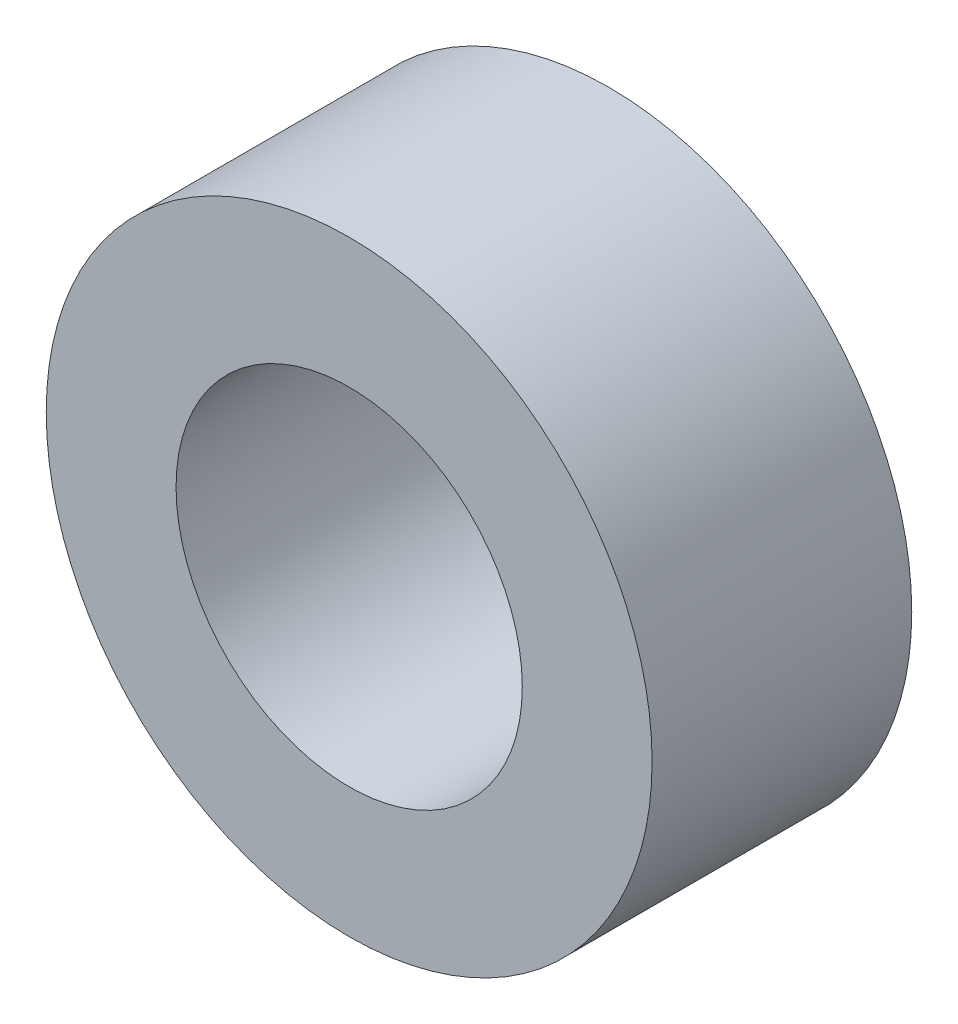
ISO-10303-21;
HEADER;
FILE_DESCRIPTION(('STEP AP214'),'2;1');
FILE_NAME('part.step','',(''),(''),'','','');
FILE_SCHEMA(('AUTOMOTIVE_DESIGN { 1 0 10303 214 1 1 1 1 }'));
ENDSEC;
DATA;
#1=APPLICATION_CONTEXT('core data for automotive mechanical design processes');
#2=APPLICATION_PROTOCOL_DEFINITION('international standard','automotive_design',2000,#1);
#3=PRODUCT_CONTEXT('',#1,'mechanical');
#4=PRODUCT('Part','Part','',(#3));
#5=PRODUCT_RELATED_PRODUCT_CATEGORY('part','',(#4));
#6=PRODUCT_DEFINITION_FORMATION('','',#4);
#7=PRODUCT_DEFINITION_CONTEXT('part definition',#1,'design');
#8=PRODUCT_DEFINITION('design','',#6,#7);
#9=PRODUCT_DEFINITION_SHAPE('','',#8);
#10=(LENGTH_UNIT() NAMED_UNIT(*) SI_UNIT(.MILLI.,.METRE.));
#11=(NAMED_UNIT(*) PLANE_ANGLE_UNIT() SI_UNIT($,.RADIAN.));
#12=(NAMED_UNIT(*) SI_UNIT($,.STERADIAN.) SOLID_ANGLE_UNIT());
#13=UNCERTAINTY_MEASURE_WITH_UNIT(LENGTH_MEASURE(1.E-05),#10,'distance_accuracy_value','');
#14=(GEOMETRIC_REPRESENTATION_CONTEXT(3) GLOBAL_UNCERTAINTY_ASSIGNED_CONTEXT((#13)) GLOBAL_UNIT_ASSIGNED_CONTEXT((#10,
#11,#12)) REPRESENTATION_CONTEXT('',''));
#15=CARTESIAN_POINT('',(0.,0.,0.));
#16=DIRECTION('',(0.,0.,1.));
#17=DIRECTION('',(1.,0.,0.));
#18=AXIS2_PLACEMENT_3D('',#15,#16,#17);
#19=CARTESIAN_POINT('',(0.,0.,6.));
#20=DIRECTION('',(0.,0.,1.));
#21=DIRECTION('',(1.,0.,0.));
#22=AXIS2_PLACEMENT_3D('',#19,#20,#21);
#23=PLANE('',#22);
#24=CARTESIAN_POINT('',(0.,0.,6.));
#25=DIRECTION('',(0.,0.,1.));
#26=DIRECTION('',(1.,0.,0.));
#27=AXIS2_PLACEMENT_3D('',#24,#25,#26);
#28=CIRCLE('',#27,7.);
#29=CARTESIAN_POINT('',(7.,0.,6.));
#30=VERTEX_POINT('',#29);
#31=EDGE_CURVE('E10',#30,#30,#28,.T.);
#32=ORIENTED_EDGE('',*,*,#31,.T.);
#33=EDGE_LOOP('',(#32));
#34=FACE_BOUND('',#33,.T.);
#35=CARTESIAN_POINT('',(0.,0.,6.));
#36=DIRECTION('',(0.,0.,1.));
#37=DIRECTION('',(1.,0.,0.));
#38=AXIS2_PLACEMENT_3D('',#35,#36,#37);
#39=CIRCLE('',#38,4.);
#40=CARTESIAN_POINT('',(4.,0.,6.));
#41=VERTEX_POINT('',#40);
#42=EDGE_CURVE('E41',#41,#41,#39,.T.);
#43=ORIENTED_EDGE('',*,*,#42,.F.);
#44=EDGE_LOOP('',(#43));
#45=FACE_BOUND('',#44,.T.);
#46=ADVANCED_FACE('F30',(#34,#45),#23,.T.);
#47=CARTESIAN_POINT('',(0.,0.,0.));
#48=DIRECTION('',(0.,0.,1.));
#49=DIRECTION('',(1.,0.,0.));
#50=AXIS2_PLACEMENT_3D('',#47,#48,#49);
#51=PLANE('',#50);
#52=CARTESIAN_POINT('',(0.,0.,0.));
#53=DIRECTION('',(0.,0.,1.));
#54=DIRECTION('',(1.,0.,0.));
#55=AXIS2_PLACEMENT_3D('',#52,#53,#54);
#56=CIRCLE('',#55,7.);
#57=CARTESIAN_POINT('',(7.,0.,0.));
#58=VERTEX_POINT('',#57);
#59=EDGE_CURVE('E34',#58,#58,#56,.T.);
#60=ORIENTED_EDGE('',*,*,#59,.F.);
#61=EDGE_LOOP('',(#60));
#62=FACE_BOUND('',#61,.T.);
#63=CARTESIAN_POINT('',(0.,0.,0.));
#64=DIRECTION('',(0.,0.,1.));
#65=DIRECTION('',(1.,0.,0.));
#66=AXIS2_PLACEMENT_3D('',#63,#64,#65);
#67=CIRCLE('',#66,4.);
#68=CARTESIAN_POINT('',(4.,0.,0.));
#69=VERTEX_POINT('',#68);
#70=EDGE_CURVE('E43',#69,#69,#67,.T.);
#71=ORIENTED_EDGE('',*,*,#70,.T.);
#72=EDGE_LOOP('',(#71));
#73=FACE_BOUND('',#72,.T.);
#74=ADVANCED_FACE('F53',(#62,#73),#51,.F.);
#75=CARTESIAN_POINT('',(0.,0.,6.));
#76=DIRECTION('',(0.,0.,-1.));
#77=DIRECTION('',(-1.,0.,0.));
#78=AXIS2_PLACEMENT_3D('',#75,#76,#77);
#79=CYLINDRICAL_SURFACE('',#78,7.);
#80=ORIENTED_EDGE('',*,*,#31,.F.);
#81=EDGE_LOOP('',(#80));
#82=FACE_BOUND('',#81,.T.);
#83=ORIENTED_EDGE('',*,*,#59,.T.);
#84=EDGE_LOOP('',(#83));
#85=FACE_BOUND('',#84,.T.);
#86=ADVANCED_FACE('F32',(#82,#85),#79,.T.);
#87=CARTESIAN_POINT('',(0.,0.,6.));
#88=DIRECTION('',(0.,0.,-1.));
#89=DIRECTION('',(-1.,0.,0.));
#90=AXIS2_PLACEMENT_3D('',#87,#88,#89);
#91=CYLINDRICAL_SURFACE('',#90,4.);
#92=ORIENTED_EDGE('',*,*,#42,.T.);
#93=EDGE_LOOP('',(#92));
#94=FACE_BOUND('',#93,.T.);
#95=ORIENTED_EDGE('',*,*,#70,.F.);
#96=EDGE_LOOP('',(#95));
#97=FACE_BOUND('',#96,.T.);
#98=ADVANCED_FACE('F49',(#94,#97),#91,.F.);
#99=CLOSED_SHELL('',(#46,#74,#86,#98));
#100=MANIFOLD_SOLID_BREP('B2',#99);
#101=ADVANCED_BREP_SHAPE_REPRESENTATION('',(#18,#100),#14);
#102=SHAPE_DEFINITION_REPRESENTATION(#9,#101);
ENDSEC;
END-ISO-10303-21;
